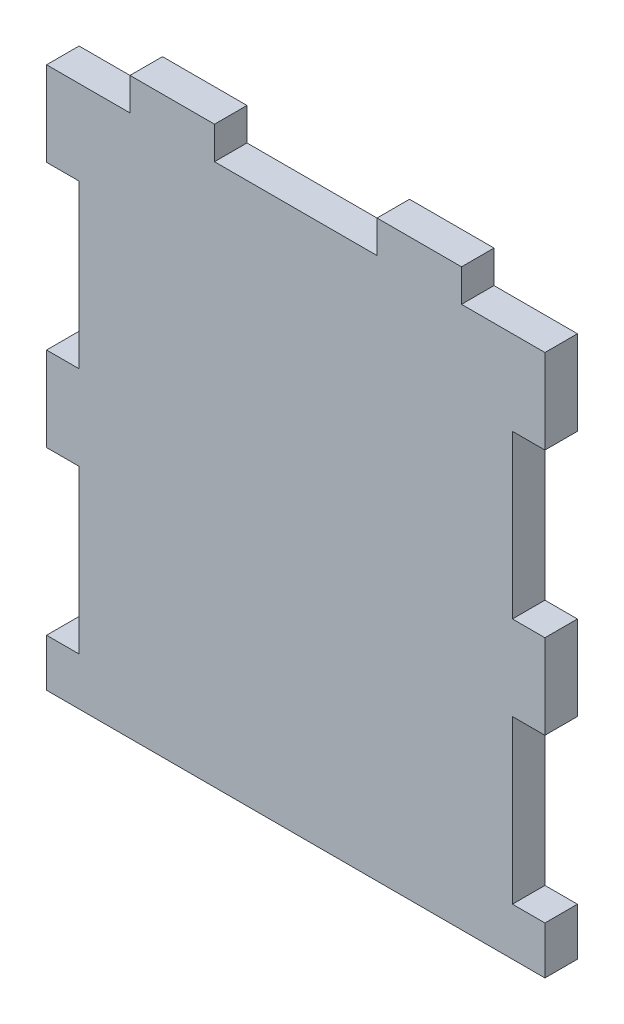
ISO-10303-21;
HEADER;
FILE_DESCRIPTION(('STEP AP214'),'2;1');
FILE_NAME('part.step','',(''),(''),'','','');
FILE_SCHEMA(('AUTOMOTIVE_DESIGN { 1 0 10303 214 1 1 1 1 }'));
ENDSEC;
DATA;
#1=APPLICATION_CONTEXT('core data for automotive mechanical design processes');
#2=APPLICATION_PROTOCOL_DEFINITION('international standard','automotive_design',2000,#1);
#3=PRODUCT_CONTEXT('',#1,'mechanical');
#4=PRODUCT('Part','Part','',(#3));
#5=PRODUCT_RELATED_PRODUCT_CATEGORY('part','',(#4));
#6=PRODUCT_DEFINITION_FORMATION('','',#4);
#7=PRODUCT_DEFINITION_CONTEXT('part definition',#1,'design');
#8=PRODUCT_DEFINITION('design','',#6,#7);
#9=PRODUCT_DEFINITION_SHAPE('','',#8);
#10=(LENGTH_UNIT() NAMED_UNIT(*) SI_UNIT(.MILLI.,.METRE.));
#11=(NAMED_UNIT(*) PLANE_ANGLE_UNIT() SI_UNIT($,.RADIAN.));
#12=(NAMED_UNIT(*) SI_UNIT($,.STERADIAN.) SOLID_ANGLE_UNIT());
#13=UNCERTAINTY_MEASURE_WITH_UNIT(LENGTH_MEASURE(1.E-05),#10,'distance_accuracy_value','');
#14=(GEOMETRIC_REPRESENTATION_CONTEXT(3) GLOBAL_UNCERTAINTY_ASSIGNED_CONTEXT((#13)) GLOBAL_UNIT_ASSIGNED_CONTEXT((#10,
#11,#12)) REPRESENTATION_CONTEXT('',''));
#15=CARTESIAN_POINT('',(0.,0.,0.));
#16=DIRECTION('',(0.,0.,1.));
#17=DIRECTION('',(1.,0.,0.));
#18=AXIS2_PLACEMENT_3D('',#15,#16,#17);
#19=CARTESIAN_POINT('',(-40.9934606481482,16.5420138888889,3.));
#20=DIRECTION('',(0.,-1.,0.));
#21=DIRECTION('',(0.,0.,-1.));
#22=AXIS2_PLACEMENT_3D('',#19,#20,#21);
#23=PLANE('',#22);
#24=DIRECTION('',(0.,0.,1.));
#25=VECTOR('',#24,1.);
#26=CARTESIAN_POINT('',(-10.4934606481481,16.5420138888889,0.));
#27=LINE('',#26,#25);
#28=CARTESIAN_POINT('',(-10.4934606481481,16.5420138888889,0.));
#29=VERTEX_POINT('',#28);
#30=CARTESIAN_POINT('',(-10.4934606481481,16.5420138888889,3.));
#31=VERTEX_POINT('',#30);
#32=EDGE_CURVE('E246',#29,#31,#27,.T.);
#33=ORIENTED_EDGE('',*,*,#32,.F.);
#34=DIRECTION('',(-1.,0.,0.));
#35=VECTOR('',#34,1.);
#36=CARTESIAN_POINT('',(-40.9934606481482,16.5420138888889,0.));
#37=LINE('',#36,#35);
#38=CARTESIAN_POINT('',(-25.4934606481481,16.5420138888889,0.));
#39=VERTEX_POINT('',#38);
#40=EDGE_CURVE('E415',#29,#39,#37,.T.);
#41=ORIENTED_EDGE('',*,*,#40,.T.);
#42=DIRECTION('',(0.,0.,-1.));
#43=VECTOR('',#42,1.);
#44=CARTESIAN_POINT('',(-25.4934606481481,16.5420138888889,0.));
#45=LINE('',#44,#43);
#46=CARTESIAN_POINT('',(-25.4934606481481,16.5420138888889,3.));
#47=VERTEX_POINT('',#46);
#48=EDGE_CURVE('E250',#47,#39,#45,.T.);
#49=ORIENTED_EDGE('',*,*,#48,.F.);
#50=DIRECTION('',(-1.,0.,0.));
#51=VECTOR('',#50,1.);
#52=CARTESIAN_POINT('',(-40.9934606481482,16.5420138888889,3.));
#53=LINE('',#52,#51);
#54=EDGE_CURVE('E52',#31,#47,#53,.T.);
#55=ORIENTED_EDGE('',*,*,#54,.F.);
#56=EDGE_LOOP('',(#33,#41,#49,#55));
#57=FACE_BOUND('',#56,.T.);
#58=ADVANCED_FACE('F37',(#57),#23,.F.);
#59=DIRECTION('',(0.,0.,-1.));
#60=VECTOR('',#59,1.);
#61=CARTESIAN_POINT('',(-2.69346064814815,16.5420138888889,0.));
#62=LINE('',#61,#60);
#63=CARTESIAN_POINT('',(-2.69346064814815,16.5420138888889,3.));
#64=VERTEX_POINT('',#63);
#65=CARTESIAN_POINT('',(-2.69346064814815,16.5420138888889,0.));
#66=VERTEX_POINT('',#65);
#67=EDGE_CURVE('E60',#64,#66,#62,.T.);
#68=ORIENTED_EDGE('',*,*,#67,.F.);
#69=CARTESIAN_POINT('',(5.00653935185185,16.5420138888889,3.));
#70=VERTEX_POINT('',#69);
#71=EDGE_CURVE('E398',#70,#64,#53,.T.);
#72=ORIENTED_EDGE('',*,*,#71,.F.);
#73=DIRECTION('',(0.,0.,-1.));
#74=VECTOR('',#73,1.);
#75=CARTESIAN_POINT('',(5.00653935185185,16.5420138888889,3.));
#76=LINE('',#75,#74);
#77=CARTESIAN_POINT('',(5.00653935185185,16.5420138888889,0.));
#78=VERTEX_POINT('',#77);
#79=EDGE_CURVE('E418',#70,#78,#76,.T.);
#80=ORIENTED_EDGE('',*,*,#79,.T.);
#81=EDGE_CURVE('E413',#78,#66,#37,.T.);
#82=ORIENTED_EDGE('',*,*,#81,.T.);
#83=EDGE_LOOP('',(#68,#72,#80,#82));
#84=FACE_BOUND('',#83,.T.);
#85=ADVANCED_FACE('F499',(#84),#23,.F.);
#86=DIRECTION('',(0.,0.,1.));
#87=VECTOR('',#86,1.);
#88=CARTESIAN_POINT('',(-33.2934606481481,16.5420138888889,0.));
#89=LINE('',#88,#87);
#90=CARTESIAN_POINT('',(-33.2934606481481,16.5420138888889,0.));
#91=VERTEX_POINT('',#90);
#92=CARTESIAN_POINT('',(-33.2934606481481,16.5420138888889,3.));
#93=VERTEX_POINT('',#92);
#94=EDGE_CURVE('E247',#91,#93,#89,.T.);
#95=ORIENTED_EDGE('',*,*,#94,.F.);
#96=CARTESIAN_POINT('',(-40.9934606481482,16.5420138888889,0.));
#97=VERTEX_POINT('',#96);
#98=EDGE_CURVE('E411',#91,#97,#37,.T.);
#99=ORIENTED_EDGE('',*,*,#98,.T.);
#100=DIRECTION('',(0.,0.,-1.));
#101=VECTOR('',#100,1.);
#102=CARTESIAN_POINT('',(-40.9934606481482,16.5420138888889,3.));
#103=LINE('',#102,#101);
#104=CARTESIAN_POINT('',(-40.9934606481482,16.5420138888889,3.));
#105=VERTEX_POINT('',#104);
#106=EDGE_CURVE('E400',#105,#97,#103,.T.);
#107=ORIENTED_EDGE('',*,*,#106,.F.);
#108=EDGE_CURVE('E396',#93,#105,#53,.T.);
#109=ORIENTED_EDGE('',*,*,#108,.F.);
#110=EDGE_LOOP('',(#95,#99,#107,#109));
#111=FACE_BOUND('',#110,.T.);
#112=ADVANCED_FACE('F471',(#111),#23,.F.);
#113=CARTESIAN_POINT('',(5.00653935185185,16.5420138888889,3.));
#114=DIRECTION('',(-1.,0.,0.));
#115=DIRECTION('',(0.,-1.,0.));
#116=AXIS2_PLACEMENT_3D('',#113,#114,#115);
#117=PLANE('',#116);
#118=DIRECTION('',(0.,1.,0.));
#119=VECTOR('',#118,1.);
#120=CARTESIAN_POINT('',(5.00653935185185,16.5420138888889,0.));
#121=LINE('',#120,#119);
#122=CARTESIAN_POINT('',(5.00653935185186,-33.4579861111111,0.));
#123=VERTEX_POINT('',#122);
#124=CARTESIAN_POINT('',(5.00653935185185,-29.0579861111111,0.));
#125=VERTEX_POINT('',#124);
#126=EDGE_CURVE('E408',#123,#125,#121,.T.);
#127=ORIENTED_EDGE('',*,*,#126,.T.);
#128=DIRECTION('',(0.,0.,1.));
#129=VECTOR('',#128,1.);
#130=CARTESIAN_POINT('',(5.00653935185185,-29.0579861111111,0.));
#131=LINE('',#130,#129);
#132=CARTESIAN_POINT('',(5.00653935185185,-29.0579861111111,3.));
#133=VERTEX_POINT('',#132);
#134=EDGE_CURVE('E297',#125,#133,#131,.T.);
#135=ORIENTED_EDGE('',*,*,#134,.T.);
#136=DIRECTION('',(0.,1.,0.));
#137=VECTOR('',#136,1.);
#138=CARTESIAN_POINT('',(5.00653935185185,16.5420138888889,3.));
#139=LINE('',#138,#137);
#140=CARTESIAN_POINT('',(5.00653935185186,-33.4579861111111,3.));
#141=VERTEX_POINT('',#140);
#142=EDGE_CURVE('E393',#141,#133,#139,.T.);
#143=ORIENTED_EDGE('',*,*,#142,.F.);
#144=DIRECTION('',(0.,0.,-1.));
#145=VECTOR('',#144,1.);
#146=CARTESIAN_POINT('',(5.00653935185186,-33.4579861111111,3.));
#147=LINE('',#146,#145);
#148=EDGE_CURVE('E45',#141,#123,#147,.T.);
#149=ORIENTED_EDGE('',*,*,#148,.T.);
#150=EDGE_LOOP('',(#127,#135,#143,#149));
#151=FACE_BOUND('',#150,.T.);
#152=ADVANCED_FACE('F425',(#151),#117,.F.);
#153=CARTESIAN_POINT('',(-40.9934606481482,16.5420138888889,3.));
#154=DIRECTION('',(1.,0.,0.));
#155=DIRECTION('',(0.,0.,-1.));
#156=AXIS2_PLACEMENT_3D('',#153,#154,#155);
#157=PLANE('',#156);
#158=DIRECTION('',(0.,-1.,0.));
#159=VECTOR('',#158,1.);
#160=CARTESIAN_POINT('',(-40.9934606481482,16.5420138888889,0.));
#161=LINE('',#160,#159);
#162=CARTESIAN_POINT('',(-40.9934606481481,-6.25798611111111,0.));
#163=VERTEX_POINT('',#162);
#164=CARTESIAN_POINT('',(-40.9934606481482,-14.0579861111111,0.));
#165=VERTEX_POINT('',#164);
#166=EDGE_CURVE('E405',#163,#165,#161,.T.);
#167=ORIENTED_EDGE('',*,*,#166,.T.);
#168=DIRECTION('',(0.,0.,1.));
#169=VECTOR('',#168,1.);
#170=CARTESIAN_POINT('',(-40.9934606481482,-14.0579861111111,0.));
#171=LINE('',#170,#169);
#172=CARTESIAN_POINT('',(-40.9934606481482,-14.0579861111111,3.));
#173=VERTEX_POINT('',#172);
#174=EDGE_CURVE('E323',#165,#173,#171,.T.);
#175=ORIENTED_EDGE('',*,*,#174,.T.);
#176=DIRECTION('',(0.,-1.,0.));
#177=VECTOR('',#176,1.);
#178=CARTESIAN_POINT('',(-40.9934606481482,16.5420138888889,3.));
#179=LINE('',#178,#177);
#180=CARTESIAN_POINT('',(-40.9934606481481,-6.25798611111111,3.));
#181=VERTEX_POINT('',#180);
#182=EDGE_CURVE('E389',#181,#173,#179,.T.);
#183=ORIENTED_EDGE('',*,*,#182,.F.);
#184=DIRECTION('',(0.,0.,1.));
#185=VECTOR('',#184,1.);
#186=CARTESIAN_POINT('',(-40.9934606481481,-6.25798611111111,0.));
#187=LINE('',#186,#185);
#188=EDGE_CURVE('E342',#163,#181,#187,.T.);
#189=ORIENTED_EDGE('',*,*,#188,.F.);
#190=EDGE_LOOP('',(#167,#175,#183,#189));
#191=FACE_BOUND('',#190,.T.);
#192=ADVANCED_FACE('F446',(#191),#157,.F.);
#193=CARTESIAN_POINT('',(-40.9934606481482,8.74201388888889,0.));
#194=VERTEX_POINT('',#193);
#195=EDGE_CURVE('E401',#97,#194,#161,.T.);
#196=ORIENTED_EDGE('',*,*,#195,.T.);
#197=DIRECTION('',(0.,0.,1.));
#198=VECTOR('',#197,1.);
#199=CARTESIAN_POINT('',(-40.9934606481482,8.74201388888889,0.));
#200=LINE('',#199,#198);
#201=CARTESIAN_POINT('',(-40.9934606481482,8.74201388888889,3.));
#202=VERTEX_POINT('',#201);
#203=EDGE_CURVE('E351',#194,#202,#200,.T.);
#204=ORIENTED_EDGE('',*,*,#203,.T.);
#205=EDGE_CURVE('E385',#105,#202,#179,.T.);
#206=ORIENTED_EDGE('',*,*,#205,.F.);
#207=ORIENTED_EDGE('',*,*,#106,.T.);
#208=EDGE_LOOP('',(#196,#204,#206,#207));
#209=FACE_BOUND('',#208,.T.);
#210=ADVANCED_FACE('F467',(#209),#157,.F.);
#211=CARTESIAN_POINT('',(5.00653935185185,-14.0579861111111,3.));
#212=VERTEX_POINT('',#211);
#213=CARTESIAN_POINT('',(5.00653935185186,-6.25798611111111,3.));
#214=VERTEX_POINT('',#213);
#215=EDGE_CURVE('E397',#212,#214,#139,.T.);
#216=ORIENTED_EDGE('',*,*,#215,.F.);
#217=DIRECTION('',(0.,0.,1.));
#218=VECTOR('',#217,1.);
#219=CARTESIAN_POINT('',(5.00653935185185,-14.0579861111111,0.));
#220=LINE('',#219,#218);
#221=CARTESIAN_POINT('',(5.00653935185185,-14.0579861111111,0.));
#222=VERTEX_POINT('',#221);
#223=EDGE_CURVE('E290',#222,#212,#220,.T.);
#224=ORIENTED_EDGE('',*,*,#223,.F.);
#225=CARTESIAN_POINT('',(5.00653935185186,-6.25798611111111,0.));
#226=VERTEX_POINT('',#225);
#227=EDGE_CURVE('E412',#222,#226,#121,.T.);
#228=ORIENTED_EDGE('',*,*,#227,.T.);
#229=DIRECTION('',(0.,0.,1.));
#230=VECTOR('',#229,1.);
#231=CARTESIAN_POINT('',(5.00653935185186,-6.25798611111111,0.));
#232=LINE('',#231,#230);
#233=EDGE_CURVE('E347',#226,#214,#232,.T.);
#234=ORIENTED_EDGE('',*,*,#233,.T.);
#235=EDGE_LOOP('',(#216,#224,#228,#234));
#236=FACE_BOUND('',#235,.T.);
#237=ADVANCED_FACE('F512',(#236),#117,.F.);
#238=CARTESIAN_POINT('',(-40.9934606481482,-29.0579861111111,3.));
#239=VERTEX_POINT('',#238);
#240=CARTESIAN_POINT('',(-40.9934606481482,-33.4579861111111,3.));
#241=VERTEX_POINT('',#240);
#242=EDGE_CURVE('E390',#239,#241,#179,.T.);
#243=ORIENTED_EDGE('',*,*,#242,.F.);
#244=DIRECTION('',(0.,0.,1.));
#245=VECTOR('',#244,1.);
#246=CARTESIAN_POINT('',(-40.9934606481482,-29.0579861111111,0.));
#247=LINE('',#246,#245);
#248=CARTESIAN_POINT('',(-40.9934606481482,-29.0579861111111,0.));
#249=VERTEX_POINT('',#248);
#250=EDGE_CURVE('E316',#249,#239,#247,.T.);
#251=ORIENTED_EDGE('',*,*,#250,.F.);
#252=CARTESIAN_POINT('',(-40.9934606481482,-33.4579861111111,0.));
#253=VERTEX_POINT('',#252);
#254=EDGE_CURVE('E354',#249,#253,#161,.T.);
#255=ORIENTED_EDGE('',*,*,#254,.T.);
#256=DIRECTION('',(0.,0.,-1.));
#257=VECTOR('',#256,1.);
#258=CARTESIAN_POINT('',(-40.9934606481482,-33.4579861111111,3.));
#259=LINE('',#258,#257);
#260=EDGE_CURVE('E11',#241,#253,#259,.T.);
#261=ORIENTED_EDGE('',*,*,#260,.F.);
#262=EDGE_LOOP('',(#243,#251,#255,#261));
#263=FACE_BOUND('',#262,.T.);
#264=ADVANCED_FACE('F39',(#263),#157,.F.);
#265=CARTESIAN_POINT('',(-40.9934606481482,-33.4579861111111,3.));
#266=DIRECTION('',(0.,1.,0.));
#267=DIRECTION('',(0.,0.,1.));
#268=AXIS2_PLACEMENT_3D('',#265,#266,#267);
#269=PLANE('',#268);
#270=DIRECTION('',(1.,0.,0.));
#271=VECTOR('',#270,1.);
#272=CARTESIAN_POINT('',(-40.9934606481482,-33.4579861111111,0.));
#273=LINE('',#272,#271);
#274=EDGE_CURVE('E404',#253,#123,#273,.T.);
#275=ORIENTED_EDGE('',*,*,#274,.T.);
#276=ORIENTED_EDGE('',*,*,#148,.F.);
#277=DIRECTION('',(1.,0.,0.));
#278=VECTOR('',#277,1.);
#279=CARTESIAN_POINT('',(-40.9934606481482,-33.4579861111111,3.));
#280=LINE('',#279,#278);
#281=EDGE_CURVE('E388',#241,#141,#280,.T.);
#282=ORIENTED_EDGE('',*,*,#281,.F.);
#283=ORIENTED_EDGE('',*,*,#260,.T.);
#284=EDGE_LOOP('',(#275,#276,#282,#283));
#285=FACE_BOUND('',#284,.T.);
#286=ADVANCED_FACE('F439',(#285),#269,.F.);
#287=CARTESIAN_POINT('',(5.00653935185186,8.74201388888887,3.));
#288=VERTEX_POINT('',#287);
#289=EDGE_CURVE('E392',#288,#70,#139,.T.);
#290=ORIENTED_EDGE('',*,*,#289,.F.);
#291=DIRECTION('',(0.,0.,1.));
#292=VECTOR('',#291,1.);
#293=CARTESIAN_POINT('',(5.00653935185186,8.74201388888887,0.));
#294=LINE('',#293,#292);
#295=CARTESIAN_POINT('',(5.00653935185186,8.74201388888887,0.));
#296=VERTEX_POINT('',#295);
#297=EDGE_CURVE('E370',#296,#288,#294,.T.);
#298=ORIENTED_EDGE('',*,*,#297,.F.);
#299=EDGE_CURVE('E407',#296,#78,#121,.T.);
#300=ORIENTED_EDGE('',*,*,#299,.T.);
#301=ORIENTED_EDGE('',*,*,#79,.F.);
#302=EDGE_LOOP('',(#290,#298,#300,#301));
#303=FACE_BOUND('',#302,.T.);
#304=ADVANCED_FACE('F513',(#303),#117,.F.);
#305=CARTESIAN_POINT('',(0.,0.,3.));
#306=DIRECTION('',(0.,0.,1.));
#307=DIRECTION('',(1.,0.,0.));
#308=AXIS2_PLACEMENT_3D('',#305,#306,#307);
#309=PLANE('',#308);
#310=DIRECTION('',(1.,0.,0.));
#311=VECTOR('',#310,1.);
#312=CARTESIAN_POINT('',(5.00653935185185,-29.0579861111111,3.));
#313=LINE('',#312,#311);
#314=CARTESIAN_POINT('',(2.00653935185185,-29.0579861111111,3.));
#315=VERTEX_POINT('',#314);
#316=EDGE_CURVE('E284',#315,#133,#313,.T.);
#317=ORIENTED_EDGE('',*,*,#316,.F.);
#318=DIRECTION('',(0.,-1.,0.));
#319=VECTOR('',#318,1.);
#320=CARTESIAN_POINT('',(2.00653935185185,-14.0579861111111,3.));
#321=LINE('',#320,#319);
#322=CARTESIAN_POINT('',(2.00653935185185,-14.0579861111111,3.));
#323=VERTEX_POINT('',#322);
#324=EDGE_CURVE('E293',#323,#315,#321,.T.);
#325=ORIENTED_EDGE('',*,*,#324,.F.);
#326=DIRECTION('',(-1.,0.,0.));
#327=VECTOR('',#326,1.);
#328=CARTESIAN_POINT('',(5.00653935185185,-14.0579861111111,3.));
#329=LINE('',#328,#327);
#330=EDGE_CURVE('E279',#212,#323,#329,.T.);
#331=ORIENTED_EDGE('',*,*,#330,.F.);
#332=ORIENTED_EDGE('',*,*,#215,.T.);
#333=DIRECTION('',(1.,0.,0.));
#334=VECTOR('',#333,1.);
#335=CARTESIAN_POINT('',(5.00653935185186,-6.25798611111111,3.));
#336=LINE('',#335,#334);
#337=CARTESIAN_POINT('',(2.00653935185186,-6.25798611111111,3.));
#338=VERTEX_POINT('',#337);
#339=EDGE_CURVE('E364',#338,#214,#336,.T.);
#340=ORIENTED_EDGE('',*,*,#339,.F.);
#341=DIRECTION('',(0.,-1.,0.));
#342=VECTOR('',#341,1.);
#343=CARTESIAN_POINT('',(2.00653935185186,8.74201388888887,3.));
#344=LINE('',#343,#342);
#345=CARTESIAN_POINT('',(2.00653935185186,8.74201388888887,3.));
#346=VERTEX_POINT('',#345);
#347=EDGE_CURVE('E373',#346,#338,#344,.T.);
#348=ORIENTED_EDGE('',*,*,#347,.F.);
#349=DIRECTION('',(-1.,0.,0.));
#350=VECTOR('',#349,1.);
#351=CARTESIAN_POINT('',(5.00653935185186,8.74201388888887,3.));
#352=LINE('',#351,#350);
#353=EDGE_CURVE('E326',#288,#346,#352,.T.);
#354=ORIENTED_EDGE('',*,*,#353,.F.);
#355=ORIENTED_EDGE('',*,*,#289,.T.);
#356=ORIENTED_EDGE('',*,*,#71,.T.);
#357=DIRECTION('',(0.,-1.,0.));
#358=VECTOR('',#357,1.);
#359=CARTESIAN_POINT('',(-2.69346064814815,19.5420138888889,3.00000000000001));
#360=LINE('',#359,#358);
#361=CARTESIAN_POINT('',(-2.69346064814815,19.5420138888889,3.00000000000001));
#362=VERTEX_POINT('',#361);
#363=EDGE_CURVE('E231',#362,#64,#360,.T.);
#364=ORIENTED_EDGE('',*,*,#363,.F.);
#365=DIRECTION('',(1.,0.,0.));
#366=VECTOR('',#365,1.);
#367=CARTESIAN_POINT('',(-10.4934606481481,19.5420138888889,3.));
#368=LINE('',#367,#366);
#369=CARTESIAN_POINT('',(-10.4934606481481,19.5420138888889,3.));
#370=VERTEX_POINT('',#369);
#371=EDGE_CURVE('E223',#370,#362,#368,.T.);
#372=ORIENTED_EDGE('',*,*,#371,.F.);
#373=DIRECTION('',(0.,-1.,0.));
#374=VECTOR('',#373,1.);
#375=CARTESIAN_POINT('',(-10.4934606481481,19.5420138888889,3.));
#376=LINE('',#375,#374);
#377=EDGE_CURVE('E228',#370,#31,#376,.T.);
#378=ORIENTED_EDGE('',*,*,#377,.T.);
#379=ORIENTED_EDGE('',*,*,#54,.T.);
#380=DIRECTION('',(0.,-1.,0.));
#381=VECTOR('',#380,1.);
#382=CARTESIAN_POINT('',(-25.4934606481481,19.5420138888889,3.00000000000001));
#383=LINE('',#382,#381);
#384=CARTESIAN_POINT('',(-25.4934606481481,19.5420138888889,3.00000000000001));
#385=VERTEX_POINT('',#384);
#386=EDGE_CURVE('E273',#385,#47,#383,.T.);
#387=ORIENTED_EDGE('',*,*,#386,.F.);
#388=DIRECTION('',(1.,0.,0.));
#389=VECTOR('',#388,1.);
#390=CARTESIAN_POINT('',(-33.2934606481481,19.5420138888889,3.));
#391=LINE('',#390,#389);
#392=CARTESIAN_POINT('',(-33.2934606481481,19.5420138888889,3.));
#393=VERTEX_POINT('',#392);
#394=EDGE_CURVE('E259',#393,#385,#391,.T.);
#395=ORIENTED_EDGE('',*,*,#394,.F.);
#396=DIRECTION('',(0.,-1.,0.));
#397=VECTOR('',#396,1.);
#398=CARTESIAN_POINT('',(-33.2934606481481,19.5420138888889,3.));
#399=LINE('',#398,#397);
#400=EDGE_CURVE('E276',#393,#93,#399,.T.);
#401=ORIENTED_EDGE('',*,*,#400,.T.);
#402=ORIENTED_EDGE('',*,*,#108,.T.);
#403=ORIENTED_EDGE('',*,*,#205,.T.);
#404=DIRECTION('',(-1.,0.,0.));
#405=VECTOR('',#404,1.);
#406=CARTESIAN_POINT('',(-40.9934606481482,8.74201388888889,3.));
#407=LINE('',#406,#405);
#408=CARTESIAN_POINT('',(-37.9934606481481,8.74201388888889,3.));
#409=VERTEX_POINT('',#408);
#410=EDGE_CURVE('E336',#409,#202,#407,.T.);
#411=ORIENTED_EDGE('',*,*,#410,.F.);
#412=DIRECTION('',(0.,1.,0.));
#413=VECTOR('',#412,1.);
#414=CARTESIAN_POINT('',(-37.9934606481481,8.74201388888889,3.));
#415=LINE('',#414,#413);
#416=CARTESIAN_POINT('',(-37.9934606481481,-6.25798611111111,3.));
#417=VERTEX_POINT('',#416);
#418=EDGE_CURVE('E346',#417,#409,#415,.T.);
#419=ORIENTED_EDGE('',*,*,#418,.F.);
#420=DIRECTION('',(1.,0.,0.));
#421=VECTOR('',#420,1.);
#422=CARTESIAN_POINT('',(-40.9934606481481,-6.25798611111111,3.));
#423=LINE('',#422,#421);
#424=EDGE_CURVE('E343',#181,#417,#423,.T.);
#425=ORIENTED_EDGE('',*,*,#424,.F.);
#426=ORIENTED_EDGE('',*,*,#182,.T.);
#427=DIRECTION('',(-1.,0.,0.));
#428=VECTOR('',#427,1.);
#429=CARTESIAN_POINT('',(-40.9934606481482,-14.0579861111111,3.));
#430=LINE('',#429,#428);
#431=CARTESIAN_POINT('',(-37.9934606481482,-14.0579861111111,3.));
#432=VERTEX_POINT('',#431);
#433=EDGE_CURVE('E310',#432,#173,#430,.T.);
#434=ORIENTED_EDGE('',*,*,#433,.F.);
#435=DIRECTION('',(0.,1.,0.));
#436=VECTOR('',#435,1.);
#437=CARTESIAN_POINT('',(-37.9934606481482,-14.0579861111111,3.));
#438=LINE('',#437,#436);
#439=CARTESIAN_POINT('',(-37.9934606481482,-29.0579861111111,3.));
#440=VERTEX_POINT('',#439);
#441=EDGE_CURVE('E319',#440,#432,#438,.T.);
#442=ORIENTED_EDGE('',*,*,#441,.F.);
#443=DIRECTION('',(1.,0.,0.));
#444=VECTOR('',#443,1.);
#445=CARTESIAN_POINT('',(-40.9934606481482,-29.0579861111111,3.));
#446=LINE('',#445,#444);
#447=EDGE_CURVE('E300',#239,#440,#446,.T.);
#448=ORIENTED_EDGE('',*,*,#447,.F.);
#449=ORIENTED_EDGE('',*,*,#242,.T.);
#450=ORIENTED_EDGE('',*,*,#281,.T.);
#451=ORIENTED_EDGE('',*,*,#142,.T.);
#452=EDGE_LOOP('',(#317,#325,#331,#332,#340,#348,#354,#355,#356,#364,#372,#378,#379,#387,#395,
#401,#402,#403,#411,#419,#425,#426,#434,#442,#448,#449,#450,#451));
#453=FACE_BOUND('',#452,.T.);
#454=ADVANCED_FACE('F226',(#453),#309,.T.);
#455=CARTESIAN_POINT('',(0.,0.,0.));
#456=DIRECTION('',(0.,0.,1.));
#457=DIRECTION('',(1.,0.,0.));
#458=AXIS2_PLACEMENT_3D('',#455,#456,#457);
#459=PLANE('',#458);
#460=DIRECTION('',(0.,-1.,0.));
#461=VECTOR('',#460,1.);
#462=CARTESIAN_POINT('',(2.00653935185185,-14.0579861111111,0.));
#463=LINE('',#462,#461);
#464=CARTESIAN_POINT('',(2.00653935185185,-14.0579861111111,0.));
#465=VERTEX_POINT('',#464);
#466=CARTESIAN_POINT('',(2.00653935185185,-29.0579861111111,0.));
#467=VERTEX_POINT('',#466);
#468=EDGE_CURVE('E283',#465,#467,#463,.T.);
#469=ORIENTED_EDGE('',*,*,#468,.T.);
#470=DIRECTION('',(1.,0.,0.));
#471=VECTOR('',#470,1.);
#472=CARTESIAN_POINT('',(5.00653935185185,-29.0579861111111,0.));
#473=LINE('',#472,#471);
#474=EDGE_CURVE('E287',#467,#125,#473,.T.);
#475=ORIENTED_EDGE('',*,*,#474,.T.);
#476=ORIENTED_EDGE('',*,*,#126,.F.);
#477=ORIENTED_EDGE('',*,*,#274,.F.);
#478=ORIENTED_EDGE('',*,*,#254,.F.);
#479=DIRECTION('',(1.,0.,0.));
#480=VECTOR('',#479,1.);
#481=CARTESIAN_POINT('',(-40.9934606481482,-29.0579861111111,0.));
#482=LINE('',#481,#480);
#483=CARTESIAN_POINT('',(-37.9934606481482,-29.0579861111111,0.));
#484=VERTEX_POINT('',#483);
#485=EDGE_CURVE('E306',#249,#484,#482,.T.);
#486=ORIENTED_EDGE('',*,*,#485,.T.);
#487=DIRECTION('',(0.,1.,0.));
#488=VECTOR('',#487,1.);
#489=CARTESIAN_POINT('',(-37.9934606481482,-14.0579861111111,0.));
#490=LINE('',#489,#488);
#491=CARTESIAN_POINT('',(-37.9934606481482,-14.0579861111111,0.));
#492=VERTEX_POINT('',#491);
#493=EDGE_CURVE('E309',#484,#492,#490,.T.);
#494=ORIENTED_EDGE('',*,*,#493,.T.);
#495=DIRECTION('',(-1.,0.,0.));
#496=VECTOR('',#495,1.);
#497=CARTESIAN_POINT('',(-40.9934606481482,-14.0579861111111,0.));
#498=LINE('',#497,#496);
#499=EDGE_CURVE('E313',#492,#165,#498,.T.);
#500=ORIENTED_EDGE('',*,*,#499,.T.);
#501=ORIENTED_EDGE('',*,*,#166,.F.);
#502=DIRECTION('',(1.,0.,0.));
#503=VECTOR('',#502,1.);
#504=CARTESIAN_POINT('',(-40.9934606481481,-6.25798611111111,0.));
#505=LINE('',#504,#503);
#506=CARTESIAN_POINT('',(-37.9934606481481,-6.25798611111111,0.));
#507=VERTEX_POINT('',#506);
#508=EDGE_CURVE('E332',#163,#507,#505,.T.);
#509=ORIENTED_EDGE('',*,*,#508,.T.);
#510=DIRECTION('',(0.,1.,0.));
#511=VECTOR('',#510,1.);
#512=CARTESIAN_POINT('',(-37.9934606481481,8.74201388888889,0.));
#513=LINE('',#512,#511);
#514=CARTESIAN_POINT('',(-37.9934606481481,8.74201388888889,0.));
#515=VERTEX_POINT('',#514);
#516=EDGE_CURVE('E335',#507,#515,#513,.T.);
#517=ORIENTED_EDGE('',*,*,#516,.T.);
#518=DIRECTION('',(-1.,0.,0.));
#519=VECTOR('',#518,1.);
#520=CARTESIAN_POINT('',(-40.9934606481482,8.74201388888889,0.));
#521=LINE('',#520,#519);
#522=EDGE_CURVE('E339',#515,#194,#521,.T.);
#523=ORIENTED_EDGE('',*,*,#522,.T.);
#524=ORIENTED_EDGE('',*,*,#195,.F.);
#525=ORIENTED_EDGE('',*,*,#98,.F.);
#526=DIRECTION('',(0.,-1.,0.));
#527=VECTOR('',#526,1.);
#528=CARTESIAN_POINT('',(-33.2934606481481,19.5420138888889,0.));
#529=LINE('',#528,#527);
#530=CARTESIAN_POINT('',(-33.2934606481481,19.5420138888889,0.));
#531=VERTEX_POINT('',#530);
#532=EDGE_CURVE('E264',#531,#91,#529,.T.);
#533=ORIENTED_EDGE('',*,*,#532,.F.);
#534=DIRECTION('',(-1.,0.,0.));
#535=VECTOR('',#534,1.);
#536=CARTESIAN_POINT('',(-33.2934606481481,19.5420138888889,0.));
#537=LINE('',#536,#535);
#538=CARTESIAN_POINT('',(-25.4934606481481,19.5420138888889,0.));
#539=VERTEX_POINT('',#538);
#540=EDGE_CURVE('E263',#539,#531,#537,.T.);
#541=ORIENTED_EDGE('',*,*,#540,.F.);
#542=DIRECTION('',(0.,-1.,0.));
#543=VECTOR('',#542,1.);
#544=CARTESIAN_POINT('',(-25.4934606481481,19.5420138888889,0.));
#545=LINE('',#544,#543);
#546=EDGE_CURVE('E270',#539,#39,#545,.T.);
#547=ORIENTED_EDGE('',*,*,#546,.T.);
#548=ORIENTED_EDGE('',*,*,#40,.F.);
#549=DIRECTION('',(0.,-1.,0.));
#550=VECTOR('',#549,1.);
#551=CARTESIAN_POINT('',(-10.4934606481481,19.5420138888889,0.));
#552=LINE('',#551,#550);
#553=CARTESIAN_POINT('',(-10.4934606481481,19.5420138888889,0.));
#554=VERTEX_POINT('',#553);
#555=EDGE_CURVE('E546',#554,#29,#552,.T.);
#556=ORIENTED_EDGE('',*,*,#555,.F.);
#557=DIRECTION('',(-1.,0.,0.));
#558=VECTOR('',#557,1.);
#559=CARTESIAN_POINT('',(-10.4934606481481,19.5420138888889,0.));
#560=LINE('',#559,#558);
#561=CARTESIAN_POINT('',(-2.69346064814815,19.5420138888889,0.));
#562=VERTEX_POINT('',#561);
#563=EDGE_CURVE('E240',#562,#554,#560,.T.);
#564=ORIENTED_EDGE('',*,*,#563,.F.);
#565=DIRECTION('',(0.,-1.,0.));
#566=VECTOR('',#565,1.);
#567=CARTESIAN_POINT('',(-2.69346064814815,19.5420138888889,0.));
#568=LINE('',#567,#566);
#569=EDGE_CURVE('E252',#562,#66,#568,.T.);
#570=ORIENTED_EDGE('',*,*,#569,.T.);
#571=ORIENTED_EDGE('',*,*,#81,.F.);
#572=ORIENTED_EDGE('',*,*,#299,.F.);
#573=DIRECTION('',(-1.,0.,0.));
#574=VECTOR('',#573,1.);
#575=CARTESIAN_POINT('',(5.00653935185186,8.74201388888887,0.));
#576=LINE('',#575,#574);
#577=CARTESIAN_POINT('',(2.00653935185186,8.74201388888887,0.));
#578=VERTEX_POINT('',#577);
#579=EDGE_CURVE('E360',#296,#578,#576,.T.);
#580=ORIENTED_EDGE('',*,*,#579,.T.);
#581=DIRECTION('',(0.,-1.,0.));
#582=VECTOR('',#581,1.);
#583=CARTESIAN_POINT('',(2.00653935185186,8.74201388888887,0.));
#584=LINE('',#583,#582);
#585=CARTESIAN_POINT('',(2.00653935185186,-6.25798611111111,0.));
#586=VERTEX_POINT('',#585);
#587=EDGE_CURVE('E363',#578,#586,#584,.T.);
#588=ORIENTED_EDGE('',*,*,#587,.T.);
#589=DIRECTION('',(1.,0.,0.));
#590=VECTOR('',#589,1.);
#591=CARTESIAN_POINT('',(5.00653935185186,-6.25798611111111,0.));
#592=LINE('',#591,#590);
#593=EDGE_CURVE('E367',#586,#226,#592,.T.);
#594=ORIENTED_EDGE('',*,*,#593,.T.);
#595=ORIENTED_EDGE('',*,*,#227,.F.);
#596=DIRECTION('',(-1.,0.,0.));
#597=VECTOR('',#596,1.);
#598=CARTESIAN_POINT('',(5.00653935185185,-14.0579861111111,0.));
#599=LINE('',#598,#597);
#600=EDGE_CURVE('E280',#222,#465,#599,.T.);
#601=ORIENTED_EDGE('',*,*,#600,.T.);
#602=EDGE_LOOP('',(#469,#475,#476,#477,#478,#486,#494,#500,#501,#509,#517,#523,#524,#525,#533,
#541,#547,#548,#556,#564,#570,#571,#572,#580,#588,#594,#595,#601));
#603=FACE_BOUND('',#602,.T.);
#604=ADVANCED_FACE('F430',(#603),#459,.F.);
#605=CARTESIAN_POINT('',(5.00653935185186,-6.25798611111111,0.));
#606=DIRECTION('',(0.,-1.,0.));
#607=DIRECTION('',(1.,0.,0.));
#608=AXIS2_PLACEMENT_3D('',#605,#606,#607);
#609=PLANE('',#608);
#610=ORIENTED_EDGE('',*,*,#339,.T.);
#611=ORIENTED_EDGE('',*,*,#233,.F.);
#612=ORIENTED_EDGE('',*,*,#593,.F.);
#613=DIRECTION('',(0.,0.,1.));
#614=VECTOR('',#613,1.);
#615=CARTESIAN_POINT('',(2.00653935185186,-6.25798611111111,0.));
#616=LINE('',#615,#614);
#617=EDGE_CURVE('E380',#586,#338,#616,.T.);
#618=ORIENTED_EDGE('',*,*,#617,.T.);
#619=EDGE_LOOP('',(#610,#611,#612,#618));
#620=FACE_BOUND('',#619,.T.);
#621=ADVANCED_FACE('F539',(#620),#609,.F.);
#622=CARTESIAN_POINT('',(2.00653935185186,8.74201388888887,0.));
#623=DIRECTION('',(-1.,0.,0.));
#624=DIRECTION('',(0.,0.,1.));
#625=AXIS2_PLACEMENT_3D('',#622,#623,#624);
#626=PLANE('',#625);
#627=ORIENTED_EDGE('',*,*,#347,.T.);
#628=ORIENTED_EDGE('',*,*,#617,.F.);
#629=ORIENTED_EDGE('',*,*,#587,.F.);
#630=DIRECTION('',(0.,0.,1.));
#631=VECTOR('',#630,1.);
#632=CARTESIAN_POINT('',(2.00653935185186,8.74201388888887,0.));
#633=LINE('',#632,#631);
#634=EDGE_CURVE('E382',#578,#346,#633,.T.);
#635=ORIENTED_EDGE('',*,*,#634,.T.);
#636=EDGE_LOOP('',(#627,#628,#629,#635));
#637=FACE_BOUND('',#636,.T.);
#638=ADVANCED_FACE('F674',(#637),#626,.F.);
#639=CARTESIAN_POINT('',(5.00653935185186,8.74201388888887,0.));
#640=DIRECTION('',(0.,1.,0.));
#641=DIRECTION('',(-1.,0.,0.));
#642=AXIS2_PLACEMENT_3D('',#639,#640,#641);
#643=PLANE('',#642);
#644=ORIENTED_EDGE('',*,*,#353,.T.);
#645=ORIENTED_EDGE('',*,*,#634,.F.);
#646=ORIENTED_EDGE('',*,*,#579,.F.);
#647=ORIENTED_EDGE('',*,*,#297,.T.);
#648=EDGE_LOOP('',(#644,#645,#646,#647));
#649=FACE_BOUND('',#648,.T.);
#650=ADVANCED_FACE('F667',(#649),#643,.F.);
#651=CARTESIAN_POINT('',(-40.9934606481482,8.74201388888889,0.));
#652=DIRECTION('',(0.,1.,0.));
#653=DIRECTION('',(0.,0.,1.));
#654=AXIS2_PLACEMENT_3D('',#651,#652,#653);
#655=PLANE('',#654);
#656=ORIENTED_EDGE('',*,*,#410,.T.);
#657=ORIENTED_EDGE('',*,*,#203,.F.);
#658=ORIENTED_EDGE('',*,*,#522,.F.);
#659=DIRECTION('',(0.,0.,1.));
#660=VECTOR('',#659,1.);
#661=CARTESIAN_POINT('',(-37.9934606481481,8.74201388888889,0.));
#662=LINE('',#661,#660);
#663=EDGE_CURVE('E355',#515,#409,#662,.T.);
#664=ORIENTED_EDGE('',*,*,#663,.T.);
#665=EDGE_LOOP('',(#656,#657,#658,#664));
#666=FACE_BOUND('',#665,.T.);
#667=ADVANCED_FACE('F660',(#666),#655,.F.);
#668=CARTESIAN_POINT('',(-37.9934606481481,8.74201388888889,0.));
#669=DIRECTION('',(1.,0.,0.));
#670=DIRECTION('',(0.,0.,-1.));
#671=AXIS2_PLACEMENT_3D('',#668,#669,#670);
#672=PLANE('',#671);
#673=ORIENTED_EDGE('',*,*,#418,.T.);
#674=ORIENTED_EDGE('',*,*,#663,.F.);
#675=ORIENTED_EDGE('',*,*,#516,.F.);
#676=DIRECTION('',(0.,0.,1.));
#677=VECTOR('',#676,1.);
#678=CARTESIAN_POINT('',(-37.9934606481481,-6.25798611111111,0.));
#679=LINE('',#678,#677);
#680=EDGE_CURVE('E357',#507,#417,#679,.T.);
#681=ORIENTED_EDGE('',*,*,#680,.T.);
#682=EDGE_LOOP('',(#673,#674,#675,#681));
#683=FACE_BOUND('',#682,.T.);
#684=ADVANCED_FACE('F461',(#683),#672,.F.);
#685=CARTESIAN_POINT('',(-40.9934606481481,-6.25798611111111,0.));
#686=DIRECTION('',(0.,-1.,0.));
#687=DIRECTION('',(1.,0.,0.));
#688=AXIS2_PLACEMENT_3D('',#685,#686,#687);
#689=PLANE('',#688);
#690=ORIENTED_EDGE('',*,*,#424,.T.);
#691=ORIENTED_EDGE('',*,*,#680,.F.);
#692=ORIENTED_EDGE('',*,*,#508,.F.);
#693=ORIENTED_EDGE('',*,*,#188,.T.);
#694=EDGE_LOOP('',(#690,#691,#692,#693));
#695=FACE_BOUND('',#694,.T.);
#696=ADVANCED_FACE('F459',(#695),#689,.F.);
#697=CARTESIAN_POINT('',(-40.9934606481482,-14.0579861111111,0.));
#698=DIRECTION('',(0.,1.,0.));
#699=DIRECTION('',(0.,0.,1.));
#700=AXIS2_PLACEMENT_3D('',#697,#698,#699);
#701=PLANE('',#700);
#702=ORIENTED_EDGE('',*,*,#433,.T.);
#703=ORIENTED_EDGE('',*,*,#174,.F.);
#704=ORIENTED_EDGE('',*,*,#499,.F.);
#705=DIRECTION('',(0.,0.,1.));
#706=VECTOR('',#705,1.);
#707=CARTESIAN_POINT('',(-37.9934606481482,-14.0579861111111,0.));
#708=LINE('',#707,#706);
#709=EDGE_CURVE('E327',#492,#432,#708,.T.);
#710=ORIENTED_EDGE('',*,*,#709,.T.);
#711=EDGE_LOOP('',(#702,#703,#704,#710));
#712=FACE_BOUND('',#711,.T.);
#713=ADVANCED_FACE('F451',(#712),#701,.F.);
#714=CARTESIAN_POINT('',(-37.9934606481482,-14.0579861111111,0.));
#715=DIRECTION('',(1.,0.,0.));
#716=DIRECTION('',(0.,0.,-1.));
#717=AXIS2_PLACEMENT_3D('',#714,#715,#716);
#718=PLANE('',#717);
#719=ORIENTED_EDGE('',*,*,#441,.T.);
#720=ORIENTED_EDGE('',*,*,#709,.F.);
#721=ORIENTED_EDGE('',*,*,#493,.F.);
#722=DIRECTION('',(0.,0.,1.));
#723=VECTOR('',#722,1.);
#724=CARTESIAN_POINT('',(-37.9934606481482,-29.0579861111111,0.));
#725=LINE('',#724,#723);
#726=EDGE_CURVE('E329',#484,#440,#725,.T.);
#727=ORIENTED_EDGE('',*,*,#726,.T.);
#728=EDGE_LOOP('',(#719,#720,#721,#727));
#729=FACE_BOUND('',#728,.T.);
#730=ADVANCED_FACE('F632',(#729),#718,.F.);
#731=CARTESIAN_POINT('',(-40.9934606481482,-29.0579861111111,0.));
#732=DIRECTION('',(0.,-1.,0.));
#733=DIRECTION('',(1.,0.,0.));
#734=AXIS2_PLACEMENT_3D('',#731,#732,#733);
#735=PLANE('',#734);
#736=ORIENTED_EDGE('',*,*,#447,.T.);
#737=ORIENTED_EDGE('',*,*,#726,.F.);
#738=ORIENTED_EDGE('',*,*,#485,.F.);
#739=ORIENTED_EDGE('',*,*,#250,.T.);
#740=EDGE_LOOP('',(#736,#737,#738,#739));
#741=FACE_BOUND('',#740,.T.);
#742=ADVANCED_FACE('F626',(#741),#735,.F.);
#743=CARTESIAN_POINT('',(5.00653935185185,-29.0579861111111,0.));
#744=DIRECTION('',(0.,-1.,0.));
#745=DIRECTION('',(1.,0.,0.));
#746=AXIS2_PLACEMENT_3D('',#743,#744,#745);
#747=PLANE('',#746);
#748=ORIENTED_EDGE('',*,*,#316,.T.);
#749=ORIENTED_EDGE('',*,*,#134,.F.);
#750=ORIENTED_EDGE('',*,*,#474,.F.);
#751=DIRECTION('',(0.,0.,1.));
#752=VECTOR('',#751,1.);
#753=CARTESIAN_POINT('',(2.00653935185185,-29.0579861111111,0.));
#754=LINE('',#753,#752);
#755=EDGE_CURVE('E301',#467,#315,#754,.T.);
#756=ORIENTED_EDGE('',*,*,#755,.T.);
#757=EDGE_LOOP('',(#748,#749,#750,#756));
#758=FACE_BOUND('',#757,.T.);
#759=ADVANCED_FACE('F434',(#758),#747,.F.);
#760=CARTESIAN_POINT('',(2.00653935185185,-14.0579861111111,0.));
#761=DIRECTION('',(-1.,0.,0.));
#762=DIRECTION('',(0.,0.,1.));
#763=AXIS2_PLACEMENT_3D('',#760,#761,#762);
#764=PLANE('',#763);
#765=ORIENTED_EDGE('',*,*,#324,.T.);
#766=ORIENTED_EDGE('',*,*,#755,.F.);
#767=ORIENTED_EDGE('',*,*,#468,.F.);
#768=DIRECTION('',(0.,0.,1.));
#769=VECTOR('',#768,1.);
#770=CARTESIAN_POINT('',(2.00653935185185,-14.0579861111111,0.));
#771=LINE('',#770,#769);
#772=EDGE_CURVE('E303',#465,#323,#771,.T.);
#773=ORIENTED_EDGE('',*,*,#772,.T.);
#774=EDGE_LOOP('',(#765,#766,#767,#773));
#775=FACE_BOUND('',#774,.T.);
#776=ADVANCED_FACE('F494',(#775),#764,.F.);
#777=CARTESIAN_POINT('',(5.00653935185185,-14.0579861111111,0.));
#778=DIRECTION('',(0.,1.,0.));
#779=DIRECTION('',(-1.,0.,0.));
#780=AXIS2_PLACEMENT_3D('',#777,#778,#779);
#781=PLANE('',#780);
#782=ORIENTED_EDGE('',*,*,#330,.T.);
#783=ORIENTED_EDGE('',*,*,#772,.F.);
#784=ORIENTED_EDGE('',*,*,#600,.F.);
#785=ORIENTED_EDGE('',*,*,#223,.T.);
#786=EDGE_LOOP('',(#782,#783,#784,#785));
#787=FACE_BOUND('',#786,.T.);
#788=ADVANCED_FACE('F486',(#787),#781,.F.);
#789=CARTESIAN_POINT('',(-33.2934606481481,19.5420138888889,0.));
#790=DIRECTION('',(1.,0.,0.));
#791=DIRECTION('',(0.,0.,-1.));
#792=AXIS2_PLACEMENT_3D('',#789,#790,#791);
#793=PLANE('',#792);
#794=ORIENTED_EDGE('',*,*,#94,.T.);
#795=ORIENTED_EDGE('',*,*,#400,.F.);
#796=DIRECTION('',(0.,0.,1.));
#797=VECTOR('',#796,1.);
#798=CARTESIAN_POINT('',(-33.2934606481481,19.5420138888889,0.));
#799=LINE('',#798,#797);
#800=EDGE_CURVE('E256',#531,#393,#799,.T.);
#801=ORIENTED_EDGE('',*,*,#800,.F.);
#802=ORIENTED_EDGE('',*,*,#532,.T.);
#803=EDGE_LOOP('',(#794,#795,#801,#802));
#804=FACE_BOUND('',#803,.T.);
#805=ADVANCED_FACE('F484',(#804),#793,.F.);
#806=CARTESIAN_POINT('',(-25.4934606481481,19.5420138888889,0.));
#807=DIRECTION('',(-1.,0.,0.));
#808=DIRECTION('',(0.,0.,1.));
#809=AXIS2_PLACEMENT_3D('',#806,#807,#808);
#810=PLANE('',#809);
#811=ORIENTED_EDGE('',*,*,#48,.T.);
#812=ORIENTED_EDGE('',*,*,#546,.F.);
#813=DIRECTION('',(0.,0.,-1.));
#814=VECTOR('',#813,1.);
#815=CARTESIAN_POINT('',(-25.4934606481481,19.5420138888889,0.));
#816=LINE('',#815,#814);
#817=EDGE_CURVE('E261',#385,#539,#816,.T.);
#818=ORIENTED_EDGE('',*,*,#817,.F.);
#819=ORIENTED_EDGE('',*,*,#386,.T.);
#820=EDGE_LOOP('',(#811,#812,#818,#819));
#821=FACE_BOUND('',#820,.T.);
#822=ADVANCED_FACE('F475',(#821),#810,.F.);
#823=CARTESIAN_POINT('',(0.,19.5420138888889,0.));
#824=DIRECTION('',(0.,1.,0.));
#825=DIRECTION('',(0.,0.,1.));
#826=AXIS2_PLACEMENT_3D('',#823,#824,#825);
#827=PLANE('',#826);
#828=ORIENTED_EDGE('',*,*,#800,.T.);
#829=ORIENTED_EDGE('',*,*,#394,.T.);
#830=ORIENTED_EDGE('',*,*,#817,.T.);
#831=ORIENTED_EDGE('',*,*,#540,.T.);
#832=EDGE_LOOP('',(#828,#829,#830,#831));
#833=FACE_BOUND('',#832,.T.);
#834=ADVANCED_FACE('F481',(#833),#827,.T.);
#835=CARTESIAN_POINT('',(-10.4934606481481,19.5420138888889,0.));
#836=DIRECTION('',(1.,0.,0.));
#837=DIRECTION('',(0.,0.,-1.));
#838=AXIS2_PLACEMENT_3D('',#835,#836,#837);
#839=PLANE('',#838);
#840=ORIENTED_EDGE('',*,*,#32,.T.);
#841=ORIENTED_EDGE('',*,*,#377,.F.);
#842=DIRECTION('',(0.,0.,1.));
#843=VECTOR('',#842,1.);
#844=CARTESIAN_POINT('',(-10.4934606481481,19.5420138888889,0.));
#845=LINE('',#844,#843);
#846=EDGE_CURVE('E235',#554,#370,#845,.T.);
#847=ORIENTED_EDGE('',*,*,#846,.F.);
#848=ORIENTED_EDGE('',*,*,#555,.T.);
#849=EDGE_LOOP('',(#840,#841,#847,#848));
#850=FACE_BOUND('',#849,.T.);
#851=ADVANCED_FACE('F245',(#850),#839,.F.);
#852=CARTESIAN_POINT('',(-2.69346064814815,19.5420138888889,0.));
#853=DIRECTION('',(-1.,0.,0.));
#854=DIRECTION('',(0.,0.,1.));
#855=AXIS2_PLACEMENT_3D('',#852,#853,#854);
#856=PLANE('',#855);
#857=ORIENTED_EDGE('',*,*,#67,.T.);
#858=ORIENTED_EDGE('',*,*,#569,.F.);
#859=DIRECTION('',(0.,0.,-1.));
#860=VECTOR('',#859,1.);
#861=CARTESIAN_POINT('',(-2.69346064814815,19.5420138888889,0.));
#862=LINE('',#861,#860);
#863=EDGE_CURVE('E234',#362,#562,#862,.T.);
#864=ORIENTED_EDGE('',*,*,#863,.F.);
#865=ORIENTED_EDGE('',*,*,#363,.T.);
#866=EDGE_LOOP('',(#857,#858,#864,#865));
#867=FACE_BOUND('',#866,.T.);
#868=ADVANCED_FACE('F552',(#867),#856,.F.);
#869=CARTESIAN_POINT('',(22.8,19.5420138888889,0.));
#870=DIRECTION('',(0.,1.,0.));
#871=DIRECTION('',(0.,0.,1.));
#872=AXIS2_PLACEMENT_3D('',#869,#870,#871);
#873=PLANE('',#872);
#874=ORIENTED_EDGE('',*,*,#846,.T.);
#875=ORIENTED_EDGE('',*,*,#371,.T.);
#876=ORIENTED_EDGE('',*,*,#863,.T.);
#877=ORIENTED_EDGE('',*,*,#563,.T.);
#878=EDGE_LOOP('',(#874,#875,#876,#877));
#879=FACE_BOUND('',#878,.T.);
#880=ADVANCED_FACE('F238',(#879),#873,.T.);
#881=CLOSED_SHELL('',(#58,#85,#112,#152,#192,#210,#237,#264,#286,#304,#454,#604,#621,#638,#650,
#667,#684,#696,#713,#730,#742,#759,#776,#788,#805,#822,#834,#851,#868,#880));
#882=MANIFOLD_SOLID_BREP('B2',#881);
#883=ADVANCED_BREP_SHAPE_REPRESENTATION('',(#18,#882),#14);
#884=SHAPE_DEFINITION_REPRESENTATION(#9,#883);
ENDSEC;
END-ISO-10303-21;
